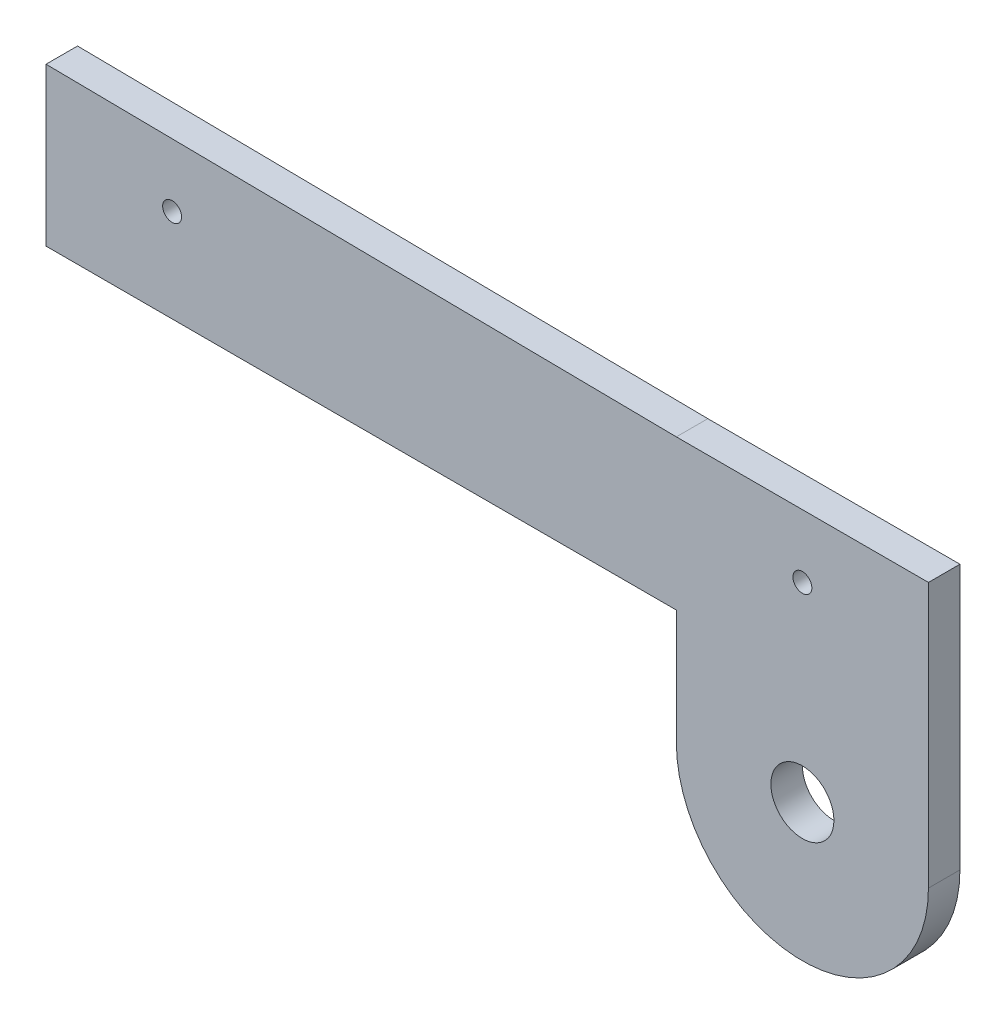
ISO-10303-21;
HEADER;
FILE_DESCRIPTION(('STEP AP214'),'2;1');
FILE_NAME('part.step','',(''),(''),'','','');
FILE_SCHEMA(('AUTOMOTIVE_DESIGN { 1 0 10303 214 1 1 1 1 }'));
ENDSEC;
DATA;
#1=APPLICATION_CONTEXT('core data for automotive mechanical design processes');
#2=APPLICATION_PROTOCOL_DEFINITION('international standard','automotive_design',2000,#1);
#3=PRODUCT_CONTEXT('',#1,'mechanical');
#4=PRODUCT('Part','Part','',(#3));
#5=PRODUCT_RELATED_PRODUCT_CATEGORY('part','',(#4));
#6=PRODUCT_DEFINITION_FORMATION('','',#4);
#7=PRODUCT_DEFINITION_CONTEXT('part definition',#1,'design');
#8=PRODUCT_DEFINITION('design','',#6,#7);
#9=PRODUCT_DEFINITION_SHAPE('','',#8);
#10=(LENGTH_UNIT() NAMED_UNIT(*) SI_UNIT(.MILLI.,.METRE.));
#11=(NAMED_UNIT(*) PLANE_ANGLE_UNIT() SI_UNIT($,.RADIAN.));
#12=(NAMED_UNIT(*) SI_UNIT($,.STERADIAN.) SOLID_ANGLE_UNIT());
#13=UNCERTAINTY_MEASURE_WITH_UNIT(LENGTH_MEASURE(1.E-05),#10,'distance_accuracy_value','');
#14=(GEOMETRIC_REPRESENTATION_CONTEXT(3) GLOBAL_UNCERTAINTY_ASSIGNED_CONTEXT((#13)) GLOBAL_UNIT_ASSIGNED_CONTEXT((#10,
#11,#12)) REPRESENTATION_CONTEXT('',''));
#15=CARTESIAN_POINT('',(0.,0.,0.));
#16=DIRECTION('',(0.,0.,1.));
#17=DIRECTION('',(1.,0.,0.));
#18=AXIS2_PLACEMENT_3D('',#15,#16,#17);
#19=CARTESIAN_POINT('',(0.,-76.7077662842641,5.));
#20=DIRECTION('',(0.,0.,1.));
#21=DIRECTION('',(1.,0.,0.));
#22=AXIS2_PLACEMENT_3D('',#19,#20,#21);
#23=PLANE('',#22);
#24=CARTESIAN_POINT('',(0.,-74.9078805598017,5.));
#25=DIRECTION('',(0.,0.,1.));
#26=DIRECTION('',(1.,0.,0.));
#27=AXIS2_PLACEMENT_3D('',#24,#25,#26);
#28=CIRCLE('',#27,5.);
#29=CARTESIAN_POINT('',(5.,-74.9078805598017,5.));
#30=VERTEX_POINT('',#29);
#31=EDGE_CURVE('E206',#30,#30,#28,.F.);
#32=ORIENTED_EDGE('',*,*,#31,.T.);
#33=EDGE_LOOP('',(#32));
#34=FACE_BOUND('',#33,.T.);
#35=CARTESIAN_POINT('',(0.,-44.7077662842641,5.));
#36=DIRECTION('',(0.,0.,1.));
#37=DIRECTION('',(1.,0.,0.));
#38=AXIS2_PLACEMENT_3D('',#35,#36,#37);
#39=CIRCLE('',#38,1.5);
#40=CARTESIAN_POINT('',(1.50000000000001,-44.7077662842641,5.));
#41=VERTEX_POINT('',#40);
#42=EDGE_CURVE('E145',#41,#41,#39,.T.);
#43=ORIENTED_EDGE('',*,*,#42,.F.);
#44=EDGE_LOOP('',(#43));
#45=FACE_BOUND('',#44,.T.);
#46=CARTESIAN_POINT('',(0.,-76.7077662842641,5.));
#47=DIRECTION('',(0.,0.,1.));
#48=DIRECTION('',(1.,0.,0.));
#49=AXIS2_PLACEMENT_3D('',#46,#47,#48);
#50=CIRCLE('',#49,20.);
#51=CARTESIAN_POINT('',(-20.,-76.7077662842641,5.));
#52=VERTEX_POINT('',#51);
#53=CARTESIAN_POINT('',(20.,-76.7077662842641,5.));
#54=VERTEX_POINT('',#53);
#55=EDGE_CURVE('E160',#52,#54,#50,.T.);
#56=ORIENTED_EDGE('',*,*,#55,.T.);
#57=DIRECTION('',(0.,1.,0.));
#58=VECTOR('',#57,1.);
#59=CARTESIAN_POINT('',(20.,-34.7077662842641,5.));
#60=LINE('',#59,#58);
#61=CARTESIAN_POINT('',(20.,-34.7077662842641,5.));
#62=VERTEX_POINT('',#61);
#63=EDGE_CURVE('E102',#54,#62,#60,.T.);
#64=ORIENTED_EDGE('',*,*,#63,.T.);
#65=DIRECTION('',(-1.,0.,0.));
#66=VECTOR('',#65,1.);
#67=CARTESIAN_POINT('',(-20.,-34.7077662842641,5.));
#68=LINE('',#67,#66);
#69=CARTESIAN_POINT('',(-20.,-34.7077662842641,5.));
#70=VERTEX_POINT('',#69);
#71=EDGE_CURVE('E178',#62,#70,#68,.T.);
#72=ORIENTED_EDGE('',*,*,#71,.T.);
#73=DIRECTION('',(-0.999927573137725,0.0120353013630515,0.));
#74=VECTOR('',#73,1.);
#75=CARTESIAN_POINT('',(-20.,-34.7077662842641,5.));
#76=LINE('',#75,#74);
#77=CARTESIAN_POINT('',(-120.,-33.5041489737338,5.));
#78=VERTEX_POINT('',#77);
#79=EDGE_CURVE('E118',#70,#78,#76,.T.);
#80=ORIENTED_EDGE('',*,*,#79,.T.);
#81=DIRECTION('',(0.,-1.,0.));
#82=VECTOR('',#81,1.);
#83=CARTESIAN_POINT('',(-120.,-33.5041489737338,5.));
#84=LINE('',#83,#82);
#85=CARTESIAN_POINT('',(-120.,-58.5041489737338,5.));
#86=VERTEX_POINT('',#85);
#87=EDGE_CURVE('E112',#78,#86,#84,.T.);
#88=ORIENTED_EDGE('',*,*,#87,.T.);
#89=DIRECTION('',(1.,0.,0.));
#90=VECTOR('',#89,1.);
#91=CARTESIAN_POINT('',(-120.,-58.5041489737338,5.));
#92=LINE('',#91,#90);
#93=CARTESIAN_POINT('',(-20.,-58.5041489737338,5.));
#94=VERTEX_POINT('',#93);
#95=EDGE_CURVE('E116',#86,#94,#92,.T.);
#96=ORIENTED_EDGE('',*,*,#95,.T.);
#97=DIRECTION('',(0.,-1.,0.));
#98=VECTOR('',#97,1.);
#99=CARTESIAN_POINT('',(-20.,-76.7077662842641,5.));
#100=LINE('',#99,#98);
#101=EDGE_CURVE('E62',#94,#52,#100,.T.);
#102=ORIENTED_EDGE('',*,*,#101,.T.);
#103=EDGE_LOOP('',(#56,#64,#72,#80,#88,#96,#102));
#104=FACE_BOUND('',#103,.T.);
#105=CARTESIAN_POINT('',(-100.,-43.7455967569229,5.));
#106=DIRECTION('',(0.,0.,1.));
#107=DIRECTION('',(1.,0.,0.));
#108=AXIS2_PLACEMENT_3D('',#105,#106,#107);
#109=CIRCLE('',#108,1.5);
#110=CARTESIAN_POINT('',(-98.5,-43.7455967569229,5.));
#111=VERTEX_POINT('',#110);
#112=EDGE_CURVE('E198',#111,#111,#109,.T.);
#113=ORIENTED_EDGE('',*,*,#112,.F.);
#114=EDGE_LOOP('',(#113));
#115=FACE_BOUND('',#114,.T.);
#116=ADVANCED_FACE('F43',(#34,#45,#104,#115),#23,.T.);
#117=CARTESIAN_POINT('',(0.,-76.7077662842641,0.));
#118=DIRECTION('',(0.,0.,1.));
#119=DIRECTION('',(1.,0.,0.));
#120=AXIS2_PLACEMENT_3D('',#117,#118,#119);
#121=PLANE('',#120);
#122=CARTESIAN_POINT('',(0.,-74.9078805598017,0.));
#123=DIRECTION('',(0.,0.,1.));
#124=DIRECTION('',(1.,0.,0.));
#125=AXIS2_PLACEMENT_3D('',#122,#123,#124);
#126=CIRCLE('',#125,5.);
#127=CARTESIAN_POINT('',(5.,-74.9078805598017,0.));
#128=VERTEX_POINT('',#127);
#129=EDGE_CURVE('E47',#128,#128,#126,.F.);
#130=ORIENTED_EDGE('',*,*,#129,.F.);
#131=EDGE_LOOP('',(#130));
#132=FACE_BOUND('',#131,.T.);
#133=CARTESIAN_POINT('',(0.,-76.7077662842641,0.));
#134=DIRECTION('',(0.,0.,1.));
#135=DIRECTION('',(1.,0.,0.));
#136=AXIS2_PLACEMENT_3D('',#133,#134,#135);
#137=CIRCLE('',#136,20.);
#138=CARTESIAN_POINT('',(-20.,-76.7077662842641,0.));
#139=VERTEX_POINT('',#138);
#140=CARTESIAN_POINT('',(20.,-76.7077662842641,0.));
#141=VERTEX_POINT('',#140);
#142=EDGE_CURVE('E140',#139,#141,#137,.T.);
#143=ORIENTED_EDGE('',*,*,#142,.F.);
#144=DIRECTION('',(0.,-1.,0.));
#145=VECTOR('',#144,1.);
#146=CARTESIAN_POINT('',(-20.,-76.7077662842641,0.));
#147=LINE('',#146,#145);
#148=CARTESIAN_POINT('',(-20.,-58.5041489737338,0.));
#149=VERTEX_POINT('',#148);
#150=EDGE_CURVE('E94',#149,#139,#147,.T.);
#151=ORIENTED_EDGE('',*,*,#150,.F.);
#152=DIRECTION('',(1.,0.,0.));
#153=VECTOR('',#152,1.);
#154=CARTESIAN_POINT('',(-120.,-58.5041489737338,0.));
#155=LINE('',#154,#153);
#156=CARTESIAN_POINT('',(-120.,-58.5041489737338,0.));
#157=VERTEX_POINT('',#156);
#158=EDGE_CURVE('E88',#157,#149,#155,.T.);
#159=ORIENTED_EDGE('',*,*,#158,.F.);
#160=DIRECTION('',(0.,-1.,0.));
#161=VECTOR('',#160,1.);
#162=CARTESIAN_POINT('',(-120.,-33.5041489737338,0.));
#163=LINE('',#162,#161);
#164=CARTESIAN_POINT('',(-120.,-33.5041489737338,0.));
#165=VERTEX_POINT('',#164);
#166=EDGE_CURVE('E127',#165,#157,#163,.T.);
#167=ORIENTED_EDGE('',*,*,#166,.F.);
#168=DIRECTION('',(-0.999927573137725,0.0120353013630515,0.));
#169=VECTOR('',#168,1.);
#170=CARTESIAN_POINT('',(-20.,-34.7077662842641,0.));
#171=LINE('',#170,#169);
#172=CARTESIAN_POINT('',(-20.,-34.7077662842641,0.));
#173=VERTEX_POINT('',#172);
#174=EDGE_CURVE('E151',#173,#165,#171,.T.);
#175=ORIENTED_EDGE('',*,*,#174,.F.);
#176=DIRECTION('',(-1.,0.,0.));
#177=VECTOR('',#176,1.);
#178=CARTESIAN_POINT('',(-20.,-34.7077662842641,0.));
#179=LINE('',#178,#177);
#180=CARTESIAN_POINT('',(20.,-34.7077662842641,0.));
#181=VERTEX_POINT('',#180);
#182=EDGE_CURVE('E148',#181,#173,#179,.T.);
#183=ORIENTED_EDGE('',*,*,#182,.F.);
#184=DIRECTION('',(0.,1.,0.));
#185=VECTOR('',#184,1.);
#186=CARTESIAN_POINT('',(20.,-34.7077662842641,0.));
#187=LINE('',#186,#185);
#188=EDGE_CURVE('E144',#141,#181,#187,.T.);
#189=ORIENTED_EDGE('',*,*,#188,.F.);
#190=EDGE_LOOP('',(#143,#151,#159,#167,#175,#183,#189));
#191=FACE_BOUND('',#190,.T.);
#192=CARTESIAN_POINT('',(0.,-44.7077662842641,0.));
#193=DIRECTION('',(0.,0.,1.));
#194=DIRECTION('',(1.,0.,0.));
#195=AXIS2_PLACEMENT_3D('',#192,#193,#194);
#196=CIRCLE('',#195,1.5);
#197=CARTESIAN_POINT('',(1.50000000000001,-44.7077662842641,0.));
#198=VERTEX_POINT('',#197);
#199=EDGE_CURVE('E194',#198,#198,#196,.T.);
#200=ORIENTED_EDGE('',*,*,#199,.T.);
#201=EDGE_LOOP('',(#200));
#202=FACE_BOUND('',#201,.T.);
#203=CARTESIAN_POINT('',(-100.,-43.7455967569229,0.));
#204=DIRECTION('',(0.,0.,1.));
#205=DIRECTION('',(1.,0.,0.));
#206=AXIS2_PLACEMENT_3D('',#203,#204,#205);
#207=CIRCLE('',#206,1.5);
#208=CARTESIAN_POINT('',(-98.5,-43.7455967569229,0.));
#209=VERTEX_POINT('',#208);
#210=EDGE_CURVE('E202',#209,#209,#207,.T.);
#211=ORIENTED_EDGE('',*,*,#210,.T.);
#212=EDGE_LOOP('',(#211));
#213=FACE_BOUND('',#212,.T.);
#214=ADVANCED_FACE('F182',(#132,#191,#202,#213),#121,.F.);
#215=CARTESIAN_POINT('',(0.,-76.7077662842641,5.));
#216=DIRECTION('',(0.,0.,-1.));
#217=DIRECTION('',(-1.,0.,0.));
#218=AXIS2_PLACEMENT_3D('',#215,#216,#217);
#219=CYLINDRICAL_SURFACE('',#218,20.);
#220=ORIENTED_EDGE('',*,*,#142,.T.);
#221=DIRECTION('',(0.,0.,-1.));
#222=VECTOR('',#221,1.);
#223=CARTESIAN_POINT('',(20.,-76.7077662842641,5.));
#224=LINE('',#223,#222);
#225=EDGE_CURVE('E11',#54,#141,#224,.T.);
#226=ORIENTED_EDGE('',*,*,#225,.F.);
#227=ORIENTED_EDGE('',*,*,#55,.F.);
#228=DIRECTION('',(0.,0.,-1.));
#229=VECTOR('',#228,1.);
#230=CARTESIAN_POINT('',(-20.,-76.7077662842641,5.));
#231=LINE('',#230,#229);
#232=EDGE_CURVE('E136',#52,#139,#231,.T.);
#233=ORIENTED_EDGE('',*,*,#232,.T.);
#234=EDGE_LOOP('',(#220,#226,#227,#233));
#235=FACE_BOUND('',#234,.T.);
#236=ADVANCED_FACE('F45',(#235),#219,.T.);
#237=CARTESIAN_POINT('',(20.,-34.7077662842641,5.));
#238=DIRECTION('',(-1.,0.,0.));
#239=DIRECTION('',(0.,-1.,0.));
#240=AXIS2_PLACEMENT_3D('',#237,#238,#239);
#241=PLANE('',#240);
#242=ORIENTED_EDGE('',*,*,#188,.T.);
#243=DIRECTION('',(0.,0.,-1.));
#244=VECTOR('',#243,1.);
#245=CARTESIAN_POINT('',(20.,-34.7077662842641,5.));
#246=LINE('',#245,#244);
#247=EDGE_CURVE('E54',#62,#181,#246,.T.);
#248=ORIENTED_EDGE('',*,*,#247,.F.);
#249=ORIENTED_EDGE('',*,*,#63,.F.);
#250=ORIENTED_EDGE('',*,*,#225,.T.);
#251=EDGE_LOOP('',(#242,#248,#249,#250));
#252=FACE_BOUND('',#251,.T.);
#253=ADVANCED_FACE('F226',(#252),#241,.F.);
#254=CARTESIAN_POINT('',(-20.,-34.7077662842641,5.));
#255=DIRECTION('',(0.,-1.,0.));
#256=DIRECTION('',(0.,0.,-1.));
#257=AXIS2_PLACEMENT_3D('',#254,#255,#256);
#258=PLANE('',#257);
#259=ORIENTED_EDGE('',*,*,#182,.T.);
#260=DIRECTION('',(0.,0.,-1.));
#261=VECTOR('',#260,1.);
#262=CARTESIAN_POINT('',(-20.,-34.7077662842641,5.));
#263=LINE('',#262,#261);
#264=EDGE_CURVE('E167',#70,#173,#263,.T.);
#265=ORIENTED_EDGE('',*,*,#264,.F.);
#266=ORIENTED_EDGE('',*,*,#71,.F.);
#267=ORIENTED_EDGE('',*,*,#247,.T.);
#268=EDGE_LOOP('',(#259,#265,#266,#267));
#269=FACE_BOUND('',#268,.T.);
#270=ADVANCED_FACE('F176',(#269),#258,.F.);
#271=CARTESIAN_POINT('',(-20.,-34.7077662842641,5.));
#272=DIRECTION('',(-0.0120353013630515,-0.999927573137725,0.));
#273=DIRECTION('',(0.999927573137725,-0.0120353013630515,0.));
#274=AXIS2_PLACEMENT_3D('',#271,#272,#273);
#275=PLANE('',#274);
#276=ORIENTED_EDGE('',*,*,#174,.T.);
#277=DIRECTION('',(0.,0.,-1.));
#278=VECTOR('',#277,1.);
#279=CARTESIAN_POINT('',(-120.,-33.5041489737338,5.));
#280=LINE('',#279,#278);
#281=EDGE_CURVE('E129',#78,#165,#280,.T.);
#282=ORIENTED_EDGE('',*,*,#281,.F.);
#283=ORIENTED_EDGE('',*,*,#79,.F.);
#284=ORIENTED_EDGE('',*,*,#264,.T.);
#285=EDGE_LOOP('',(#276,#282,#283,#284));
#286=FACE_BOUND('',#285,.T.);
#287=ADVANCED_FACE('F185',(#286),#275,.F.);
#288=CARTESIAN_POINT('',(-120.,-33.5041489737338,5.));
#289=DIRECTION('',(1.,0.,0.));
#290=DIRECTION('',(0.,0.,-1.));
#291=AXIS2_PLACEMENT_3D('',#288,#289,#290);
#292=PLANE('',#291);
#293=ORIENTED_EDGE('',*,*,#166,.T.);
#294=DIRECTION('',(0.,0.,-1.));
#295=VECTOR('',#294,1.);
#296=CARTESIAN_POINT('',(-120.,-58.5041489737338,5.));
#297=LINE('',#296,#295);
#298=EDGE_CURVE('E124',#86,#157,#297,.T.);
#299=ORIENTED_EDGE('',*,*,#298,.F.);
#300=ORIENTED_EDGE('',*,*,#87,.F.);
#301=ORIENTED_EDGE('',*,*,#281,.T.);
#302=EDGE_LOOP('',(#293,#299,#300,#301));
#303=FACE_BOUND('',#302,.T.);
#304=ADVANCED_FACE('F125',(#303),#292,.F.);
#305=CARTESIAN_POINT('',(-120.,-58.5041489737338,5.));
#306=DIRECTION('',(0.,1.,0.));
#307=DIRECTION('',(-1.,0.,0.));
#308=AXIS2_PLACEMENT_3D('',#305,#306,#307);
#309=PLANE('',#308);
#310=ORIENTED_EDGE('',*,*,#158,.T.);
#311=DIRECTION('',(0.,0.,-1.));
#312=VECTOR('',#311,1.);
#313=CARTESIAN_POINT('',(-20.,-58.5041489737338,5.));
#314=LINE('',#313,#312);
#315=EDGE_CURVE('E130',#94,#149,#314,.T.);
#316=ORIENTED_EDGE('',*,*,#315,.F.);
#317=ORIENTED_EDGE('',*,*,#95,.F.);
#318=ORIENTED_EDGE('',*,*,#298,.T.);
#319=EDGE_LOOP('',(#310,#316,#317,#318));
#320=FACE_BOUND('',#319,.T.);
#321=ADVANCED_FACE('F132',(#320),#309,.F.);
#322=CARTESIAN_POINT('',(-20.,-76.7077662842641,5.));
#323=DIRECTION('',(1.,0.,0.));
#324=DIRECTION('',(0.,1.,0.));
#325=AXIS2_PLACEMENT_3D('',#322,#323,#324);
#326=PLANE('',#325);
#327=ORIENTED_EDGE('',*,*,#150,.T.);
#328=ORIENTED_EDGE('',*,*,#232,.F.);
#329=ORIENTED_EDGE('',*,*,#101,.F.);
#330=ORIENTED_EDGE('',*,*,#315,.T.);
#331=EDGE_LOOP('',(#327,#328,#329,#330));
#332=FACE_BOUND('',#331,.T.);
#333=ADVANCED_FACE('F231',(#332),#326,.F.);
#334=CARTESIAN_POINT('',(0.,-44.7077662842641,5.));
#335=DIRECTION('',(0.,0.,-1.));
#336=DIRECTION('',(-1.,0.,0.));
#337=AXIS2_PLACEMENT_3D('',#334,#335,#336);
#338=CYLINDRICAL_SURFACE('',#337,1.5);
#339=ORIENTED_EDGE('',*,*,#42,.T.);
#340=EDGE_LOOP('',(#339));
#341=FACE_BOUND('',#340,.T.);
#342=ORIENTED_EDGE('',*,*,#199,.F.);
#343=EDGE_LOOP('',(#342));
#344=FACE_BOUND('',#343,.T.);
#345=ADVANCED_FACE('F234',(#341,#344),#338,.F.);
#346=CARTESIAN_POINT('',(-100.,-43.7455967569229,5.));
#347=DIRECTION('',(0.,0.,-1.));
#348=DIRECTION('',(-1.,0.,0.));
#349=AXIS2_PLACEMENT_3D('',#346,#347,#348);
#350=CYLINDRICAL_SURFACE('',#349,1.5);
#351=ORIENTED_EDGE('',*,*,#112,.T.);
#352=EDGE_LOOP('',(#351));
#353=FACE_BOUND('',#352,.T.);
#354=ORIENTED_EDGE('',*,*,#210,.F.);
#355=EDGE_LOOP('',(#354));
#356=FACE_BOUND('',#355,.T.);
#357=ADVANCED_FACE('F275',(#353,#356),#350,.F.);
#358=CARTESIAN_POINT('',(0.,-74.9078805598017,42.));
#359=DIRECTION('',(0.,0.,-1.));
#360=DIRECTION('',(-1.,0.,0.));
#361=AXIS2_PLACEMENT_3D('',#358,#359,#360);
#362=CYLINDRICAL_SURFACE('',#361,5.);
#363=ORIENTED_EDGE('',*,*,#31,.F.);
#364=EDGE_LOOP('',(#363));
#365=FACE_BOUND('',#364,.T.);
#366=ORIENTED_EDGE('',*,*,#129,.T.);
#367=EDGE_LOOP('',(#366));
#368=FACE_BOUND('',#367,.T.);
#369=ADVANCED_FACE('F218',(#365,#368),#362,.F.);
#370=CLOSED_SHELL('',(#116,#214,#236,#253,#270,#287,#304,#321,#333,#345,#357,#369));
#371=MANIFOLD_SOLID_BREP('B2',#370);
#372=ADVANCED_BREP_SHAPE_REPRESENTATION('',(#18,#371),#14);
#373=SHAPE_DEFINITION_REPRESENTATION(#9,#372);
ENDSEC;
END-ISO-10303-21;
